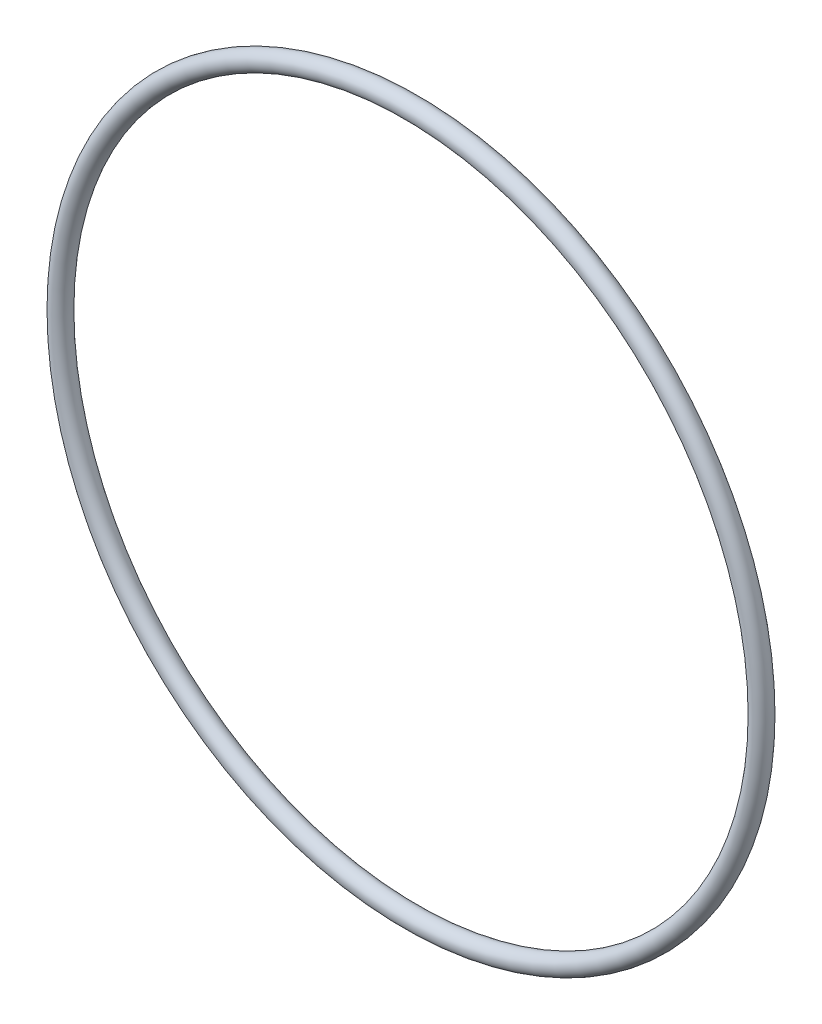
ISO-10303-21;
HEADER;
FILE_DESCRIPTION(('STEP AP214'),'2;1');
FILE_NAME('part.step','',(''),(''),'','','');
FILE_SCHEMA(('AUTOMOTIVE_DESIGN { 1 0 10303 214 1 1 1 1 }'));
ENDSEC;
DATA;
#1=APPLICATION_CONTEXT('core data for automotive mechanical design processes');
#2=APPLICATION_PROTOCOL_DEFINITION('international standard','automotive_design',2000,#1);
#3=PRODUCT_CONTEXT('',#1,'mechanical');
#4=PRODUCT('Part','Part','',(#3));
#5=PRODUCT_RELATED_PRODUCT_CATEGORY('part','',(#4));
#6=PRODUCT_DEFINITION_FORMATION('','',#4);
#7=PRODUCT_DEFINITION_CONTEXT('part definition',#1,'design');
#8=PRODUCT_DEFINITION('design','',#6,#7);
#9=PRODUCT_DEFINITION_SHAPE('','',#8);
#10=(LENGTH_UNIT() NAMED_UNIT(*) SI_UNIT(.MILLI.,.METRE.));
#11=(NAMED_UNIT(*) PLANE_ANGLE_UNIT() SI_UNIT($,.RADIAN.));
#12=(NAMED_UNIT(*) SI_UNIT($,.STERADIAN.) SOLID_ANGLE_UNIT());
#13=UNCERTAINTY_MEASURE_WITH_UNIT(LENGTH_MEASURE(1.E-05),#10,'distance_accuracy_value','');
#14=(GEOMETRIC_REPRESENTATION_CONTEXT(3) GLOBAL_UNCERTAINTY_ASSIGNED_CONTEXT((#13)) GLOBAL_UNIT_ASSIGNED_CONTEXT((#10,
#11,#12)) REPRESENTATION_CONTEXT('',''));
#15=CARTESIAN_POINT('',(0.,0.,0.));
#16=DIRECTION('',(0.,0.,1.));
#17=DIRECTION('',(1.,0.,0.));
#18=AXIS2_PLACEMENT_3D('',#15,#16,#17);
#19=CARTESIAN_POINT('',(0.,0.,0.));
#20=DIRECTION('',(0.,0.,1.));
#21=DIRECTION('',(1.,0.,0.));
#22=AXIS2_PLACEMENT_3D('',#19,#20,#21);
#23=TOROIDAL_SURFACE('',#22,65.0621,1.76529999999999);
#24=CARTESIAN_POINT('',(66.8274,0.,0.));
#25=VERTEX_POINT('',#24);
#26=VERTEX_LOOP('',#25);
#27=FACE_BOUND('',#26,.T.);
#28=ADVANCED_FACE('F34',(#27),#23,.T.);
#29=CLOSED_SHELL('',(#28));
#30=MANIFOLD_SOLID_BREP('B2',#29);
#31=ADVANCED_BREP_SHAPE_REPRESENTATION('',(#18,#30),#14);
#32=SHAPE_DEFINITION_REPRESENTATION(#9,#31);
ENDSEC;
END-ISO-10303-21;
